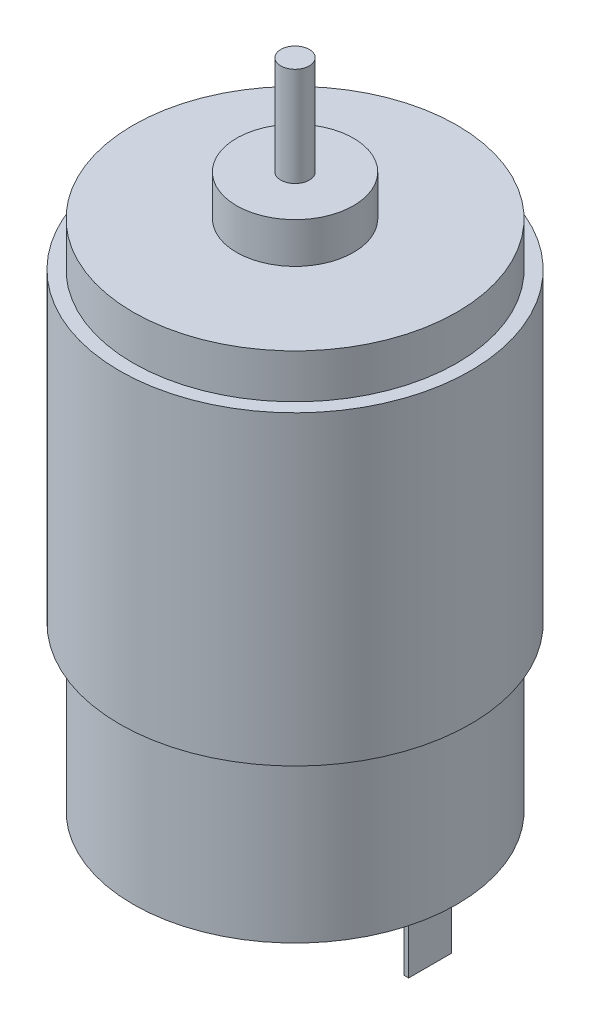
ISO-10303-21;
HEADER;
FILE_DESCRIPTION(('STEP AP214'),'2;1');
FILE_NAME('part.step','',(''),(''),'','','');
FILE_SCHEMA(('AUTOMOTIVE_DESIGN { 1 0 10303 214 1 1 1 1 }'));
ENDSEC;
DATA;
#1=APPLICATION_CONTEXT('core data for automotive mechanical design processes');
#2=APPLICATION_PROTOCOL_DEFINITION('international standard','automotive_design',2000,#1);
#3=PRODUCT_CONTEXT('',#1,'mechanical');
#4=PRODUCT('Part','Part','',(#3));
#5=PRODUCT_RELATED_PRODUCT_CATEGORY('part','',(#4));
#6=PRODUCT_DEFINITION_FORMATION('','',#4);
#7=PRODUCT_DEFINITION_CONTEXT('part definition',#1,'design');
#8=PRODUCT_DEFINITION('design','',#6,#7);
#9=PRODUCT_DEFINITION_SHAPE('','',#8);
#10=(LENGTH_UNIT() NAMED_UNIT(*) SI_UNIT(.MILLI.,.METRE.));
#11=(NAMED_UNIT(*) PLANE_ANGLE_UNIT() SI_UNIT($,.RADIAN.));
#12=(NAMED_UNIT(*) SI_UNIT($,.STERADIAN.) SOLID_ANGLE_UNIT());
#13=UNCERTAINTY_MEASURE_WITH_UNIT(LENGTH_MEASURE(1.E-05),#10,'distance_accuracy_value','');
#14=(GEOMETRIC_REPRESENTATION_CONTEXT(3) GLOBAL_UNCERTAINTY_ASSIGNED_CONTEXT((#13)) GLOBAL_UNIT_ASSIGNED_CONTEXT((#10,
#11,#12)) REPRESENTATION_CONTEXT('',''));
#15=CARTESIAN_POINT('',(0.,0.,0.));
#16=DIRECTION('',(0.,0.,1.));
#17=DIRECTION('',(1.,0.,0.));
#18=AXIS2_PLACEMENT_3D('',#15,#16,#17);
#19=CARTESIAN_POINT('',(0.,-18.1,0.));
#20=DIRECTION('',(0.,1.,0.));
#21=DIRECTION('',(0.,0.,1.));
#22=AXIS2_PLACEMENT_3D('',#19,#20,#21);
#23=PLANE('',#22);
#24=DIRECTION('',(0.,0.,-1.));
#25=VECTOR('',#24,1.);
#26=CARTESIAN_POINT('',(14.5,-18.1,2.375));
#27=LINE('',#26,#25);
#28=CARTESIAN_POINT('',(14.5,-18.1,2.375));
#29=VERTEX_POINT('',#28);
#30=CARTESIAN_POINT('',(14.5,-18.1,-2.375));
#31=VERTEX_POINT('',#30);
#32=EDGE_CURVE('E131',#29,#31,#27,.T.);
#33=ORIENTED_EDGE('',*,*,#32,.F.);
#34=DIRECTION('',(-1.,0.,0.));
#35=VECTOR('',#34,1.);
#36=CARTESIAN_POINT('',(14.5,-18.1,2.375));
#37=LINE('',#36,#35);
#38=CARTESIAN_POINT('',(15.,-18.1,2.375));
#39=VERTEX_POINT('',#38);
#40=EDGE_CURVE('E144',#39,#29,#37,.T.);
#41=ORIENTED_EDGE('',*,*,#40,.F.);
#42=DIRECTION('',(0.,0.,1.));
#43=VECTOR('',#42,1.);
#44=CARTESIAN_POINT('',(15.,-18.1,2.375));
#45=LINE('',#44,#43);
#46=CARTESIAN_POINT('',(15.,-18.1,-2.375));
#47=VERTEX_POINT('',#46);
#48=EDGE_CURVE('E153',#47,#39,#45,.T.);
#49=ORIENTED_EDGE('',*,*,#48,.F.);
#50=DIRECTION('',(1.,0.,0.));
#51=VECTOR('',#50,1.);
#52=CARTESIAN_POINT('',(14.5,-18.1,-2.375));
#53=LINE('',#52,#51);
#54=EDGE_CURVE('E134',#31,#47,#53,.T.);
#55=ORIENTED_EDGE('',*,*,#54,.F.);
#56=EDGE_LOOP('',(#33,#41,#49,#55));
#57=FACE_BOUND('',#56,.T.);
#58=CARTESIAN_POINT('',(0.,-18.1,0.));
#59=DIRECTION('',(0.,1.,0.));
#60=DIRECTION('',(0.,0.,1.));
#61=AXIS2_PLACEMENT_3D('',#58,#59,#60);
#62=CIRCLE('',#61,18.);
#63=CARTESIAN_POINT('',(0.,-18.1,18.));
#64=VERTEX_POINT('',#63);
#65=EDGE_CURVE('E181',#64,#64,#62,.T.);
#66=ORIENTED_EDGE('',*,*,#65,.F.);
#67=EDGE_LOOP('',(#66));
#68=FACE_BOUND('',#67,.T.);
#69=DIRECTION('',(-1.,0.,0.));
#70=VECTOR('',#69,1.);
#71=CARTESIAN_POINT('',(-14.5,-18.1,2.375));
#72=LINE('',#71,#70);
#73=CARTESIAN_POINT('',(-14.5,-18.1,2.375));
#74=VERTEX_POINT('',#73);
#75=CARTESIAN_POINT('',(-15.,-18.1,2.375));
#76=VERTEX_POINT('',#75);
#77=EDGE_CURVE('E130',#74,#76,#72,.T.);
#78=ORIENTED_EDGE('',*,*,#77,.F.);
#79=DIRECTION('',(0.,0.,1.));
#80=VECTOR('',#79,1.);
#81=CARTESIAN_POINT('',(-14.5,-18.1,2.375));
#82=LINE('',#81,#80);
#83=CARTESIAN_POINT('',(-14.5,-18.1,-2.375));
#84=VERTEX_POINT('',#83);
#85=EDGE_CURVE('E127',#84,#74,#82,.T.);
#86=ORIENTED_EDGE('',*,*,#85,.F.);
#87=DIRECTION('',(1.,0.,0.));
#88=VECTOR('',#87,1.);
#89=CARTESIAN_POINT('',(-14.5,-18.1,-2.375));
#90=LINE('',#89,#88);
#91=CARTESIAN_POINT('',(-15.,-18.1,-2.375));
#92=VERTEX_POINT('',#91);
#93=EDGE_CURVE('E65',#92,#84,#90,.T.);
#94=ORIENTED_EDGE('',*,*,#93,.F.);
#95=DIRECTION('',(0.,0.,-1.));
#96=VECTOR('',#95,1.);
#97=CARTESIAN_POINT('',(-15.,-18.1,2.375));
#98=LINE('',#97,#96);
#99=EDGE_CURVE('E60',#76,#92,#98,.T.);
#100=ORIENTED_EDGE('',*,*,#99,.F.);
#101=EDGE_LOOP('',(#78,#86,#94,#100));
#102=FACE_BOUND('',#101,.T.);
#103=ADVANCED_FACE('F43',(#57,#68,#102),#23,.F.);
#104=CARTESIAN_POINT('',(0.,34.,0.));
#105=DIRECTION('',(0.,1.,0.));
#106=DIRECTION('',(0.,0.,1.));
#107=AXIS2_PLACEMENT_3D('',#104,#105,#106);
#108=PLANE('',#107);
#109=CARTESIAN_POINT('',(0.,34.,0.));
#110=DIRECTION('',(0.,1.,0.));
#111=DIRECTION('',(0.,0.,1.));
#112=AXIS2_PLACEMENT_3D('',#109,#110,#111);
#113=CIRCLE('',#112,19.5);
#114=CARTESIAN_POINT('',(0.,34.,19.5));
#115=VERTEX_POINT('',#114);
#116=EDGE_CURVE('E178',#115,#115,#113,.T.);
#117=ORIENTED_EDGE('',*,*,#116,.T.);
#118=EDGE_LOOP('',(#117));
#119=FACE_BOUND('',#118,.T.);
#120=CARTESIAN_POINT('',(0.,34.,0.));
#121=DIRECTION('',(0.,1.,0.));
#122=DIRECTION('',(0.,0.,1.));
#123=AXIS2_PLACEMENT_3D('',#120,#121,#122);
#124=CIRCLE('',#123,18.);
#125=CARTESIAN_POINT('',(0.,34.,18.));
#126=VERTEX_POINT('',#125);
#127=EDGE_CURVE('E187',#126,#126,#124,.T.);
#128=ORIENTED_EDGE('',*,*,#127,.F.);
#129=EDGE_LOOP('',(#128));
#130=FACE_BOUND('',#129,.T.);
#131=ADVANCED_FACE('F199',(#119,#130),#108,.T.);
#132=CARTESIAN_POINT('',(0.,0.,0.));
#133=DIRECTION('',(0.,1.,0.));
#134=DIRECTION('',(0.,0.,1.));
#135=AXIS2_PLACEMENT_3D('',#132,#133,#134);
#136=PLANE('',#135);
#137=CARTESIAN_POINT('',(0.,0.,0.));
#138=DIRECTION('',(0.,1.,0.));
#139=DIRECTION('',(0.,0.,1.));
#140=AXIS2_PLACEMENT_3D('',#137,#138,#139);
#141=CIRCLE('',#140,19.5);
#142=CARTESIAN_POINT('',(0.,0.,19.5));
#143=VERTEX_POINT('',#142);
#144=EDGE_CURVE('E47',#143,#143,#141,.T.);
#145=ORIENTED_EDGE('',*,*,#144,.F.);
#146=EDGE_LOOP('',(#145));
#147=FACE_BOUND('',#146,.T.);
#148=CARTESIAN_POINT('',(0.,0.,0.));
#149=DIRECTION('',(0.,1.,0.));
#150=DIRECTION('',(0.,0.,1.));
#151=AXIS2_PLACEMENT_3D('',#148,#149,#150);
#152=CIRCLE('',#151,18.);
#153=CARTESIAN_POINT('',(0.,0.,18.));
#154=VERTEX_POINT('',#153);
#155=EDGE_CURVE('E184',#154,#154,#152,.T.);
#156=ORIENTED_EDGE('',*,*,#155,.T.);
#157=EDGE_LOOP('',(#156));
#158=FACE_BOUND('',#157,.T.);
#159=ADVANCED_FACE('F196',(#147,#158),#136,.F.);
#160=CARTESIAN_POINT('',(0.,34.,0.));
#161=DIRECTION('',(0.,-1.,0.));
#162=DIRECTION('',(0.,0.,-1.));
#163=AXIS2_PLACEMENT_3D('',#160,#161,#162);
#164=CYLINDRICAL_SURFACE('',#163,19.5);
#165=ORIENTED_EDGE('',*,*,#116,.F.);
#166=EDGE_LOOP('',(#165));
#167=FACE_BOUND('',#166,.T.);
#168=ORIENTED_EDGE('',*,*,#144,.T.);
#169=EDGE_LOOP('',(#168));
#170=FACE_BOUND('',#169,.T.);
#171=ADVANCED_FACE('F45',(#167,#170),#164,.T.);
#172=CARTESIAN_POINT('',(0.,-18.1,0.));
#173=DIRECTION('',(0.,1.,0.));
#174=DIRECTION('',(0.,0.,1.));
#175=AXIS2_PLACEMENT_3D('',#172,#173,#174);
#176=CYLINDRICAL_SURFACE('',#175,18.);
#177=ORIENTED_EDGE('',*,*,#65,.T.);
#178=EDGE_LOOP('',(#177));
#179=FACE_BOUND('',#178,.T.);
#180=ORIENTED_EDGE('',*,*,#155,.F.);
#181=EDGE_LOOP('',(#180));
#182=FACE_BOUND('',#181,.T.);
#183=ADVANCED_FACE('F202',(#179,#182),#176,.T.);
#184=ORIENTED_EDGE('',*,*,#127,.T.);
#185=EDGE_LOOP('',(#184));
#186=FACE_BOUND('',#185,.T.);
#187=CARTESIAN_POINT('',(0.,38.9,0.));
#188=DIRECTION('',(0.,1.,0.));
#189=DIRECTION('',(0.,0.,1.));
#190=AXIS2_PLACEMENT_3D('',#187,#188,#189);
#191=CIRCLE('',#190,18.);
#192=CARTESIAN_POINT('',(0.,38.9,18.));
#193=VERTEX_POINT('',#192);
#194=EDGE_CURVE('E175',#193,#193,#191,.T.);
#195=ORIENTED_EDGE('',*,*,#194,.F.);
#196=EDGE_LOOP('',(#195));
#197=FACE_BOUND('',#196,.T.);
#198=ADVANCED_FACE('F204',(#186,#197),#176,.T.);
#199=CARTESIAN_POINT('',(0.,38.9,0.));
#200=DIRECTION('',(0.,1.,0.));
#201=DIRECTION('',(0.,0.,1.));
#202=AXIS2_PLACEMENT_3D('',#199,#200,#201);
#203=PLANE('',#202);
#204=CARTESIAN_POINT('',(0.,38.9,0.));
#205=DIRECTION('',(0.,1.,0.));
#206=DIRECTION('',(0.,0.,1.));
#207=AXIS2_PLACEMENT_3D('',#204,#205,#206);
#208=CIRCLE('',#207,6.5);
#209=CARTESIAN_POINT('',(0.,38.9,6.5));
#210=VERTEX_POINT('',#209);
#211=EDGE_CURVE('E52',#210,#210,#208,.T.);
#212=ORIENTED_EDGE('',*,*,#211,.F.);
#213=EDGE_LOOP('',(#212));
#214=FACE_BOUND('',#213,.T.);
#215=ORIENTED_EDGE('',*,*,#194,.T.);
#216=EDGE_LOOP('',(#215));
#217=FACE_BOUND('',#216,.T.);
#218=ADVANCED_FACE('F211',(#214,#217),#203,.T.);
#219=CARTESIAN_POINT('',(0.,43.4,0.));
#220=DIRECTION('',(0.,-1.,0.));
#221=DIRECTION('',(0.,0.,-1.));
#222=AXIS2_PLACEMENT_3D('',#219,#220,#221);
#223=CYLINDRICAL_SURFACE('',#222,6.5);
#224=CARTESIAN_POINT('',(0.,43.4,0.));
#225=DIRECTION('',(0.,1.,0.));
#226=DIRECTION('',(0.,0.,1.));
#227=AXIS2_PLACEMENT_3D('',#224,#225,#226);
#228=CIRCLE('',#227,6.5);
#229=CARTESIAN_POINT('',(0.,43.4,6.5));
#230=VERTEX_POINT('',#229);
#231=EDGE_CURVE('E171',#230,#230,#228,.T.);
#232=ORIENTED_EDGE('',*,*,#231,.F.);
#233=EDGE_LOOP('',(#232));
#234=FACE_BOUND('',#233,.T.);
#235=ORIENTED_EDGE('',*,*,#211,.T.);
#236=EDGE_LOOP('',(#235));
#237=FACE_BOUND('',#236,.T.);
#238=ADVANCED_FACE('F227',(#234,#237),#223,.T.);
#239=CARTESIAN_POINT('',(0.,43.4,0.));
#240=DIRECTION('',(0.,1.,0.));
#241=DIRECTION('',(0.,0.,1.));
#242=AXIS2_PLACEMENT_3D('',#239,#240,#241);
#243=PLANE('',#242);
#244=CARTESIAN_POINT('',(0.,43.4,0.));
#245=DIRECTION('',(0.,1.,0.));
#246=DIRECTION('',(0.,0.,1.));
#247=AXIS2_PLACEMENT_3D('',#244,#245,#246);
#248=CIRCLE('',#247,1.585);
#249=CARTESIAN_POINT('',(0.,43.4,1.585));
#250=VERTEX_POINT('',#249);
#251=EDGE_CURVE('E11',#250,#250,#248,.T.);
#252=ORIENTED_EDGE('',*,*,#251,.F.);
#253=EDGE_LOOP('',(#252));
#254=FACE_BOUND('',#253,.T.);
#255=ORIENTED_EDGE('',*,*,#231,.T.);
#256=EDGE_LOOP('',(#255));
#257=FACE_BOUND('',#256,.T.);
#258=ADVANCED_FACE('F231',(#254,#257),#243,.T.);
#259=CARTESIAN_POINT('',(0.,54.4,0.));
#260=DIRECTION('',(0.,-1.,0.));
#261=DIRECTION('',(0.,0.,-1.));
#262=AXIS2_PLACEMENT_3D('',#259,#260,#261);
#263=CYLINDRICAL_SURFACE('',#262,1.585);
#264=CARTESIAN_POINT('',(0.,54.4,0.));
#265=DIRECTION('',(0.,1.,0.));
#266=DIRECTION('',(0.,0.,1.));
#267=AXIS2_PLACEMENT_3D('',#264,#265,#266);
#268=CIRCLE('',#267,1.585);
#269=CARTESIAN_POINT('',(0.,54.4,1.585));
#270=VERTEX_POINT('',#269);
#271=EDGE_CURVE('E169',#270,#270,#268,.T.);
#272=ORIENTED_EDGE('',*,*,#271,.F.);
#273=EDGE_LOOP('',(#272));
#274=FACE_BOUND('',#273,.T.);
#275=ORIENTED_EDGE('',*,*,#251,.T.);
#276=EDGE_LOOP('',(#275));
#277=FACE_BOUND('',#276,.T.);
#278=ADVANCED_FACE('F235',(#274,#277),#263,.T.);
#279=CARTESIAN_POINT('',(0.,54.4,0.));
#280=DIRECTION('',(0.,1.,0.));
#281=DIRECTION('',(0.,0.,1.));
#282=AXIS2_PLACEMENT_3D('',#279,#280,#281);
#283=PLANE('',#282);
#284=ORIENTED_EDGE('',*,*,#271,.T.);
#285=EDGE_LOOP('',(#284));
#286=FACE_BOUND('',#285,.T.);
#287=ADVANCED_FACE('F239',(#286),#283,.T.);
#288=CARTESIAN_POINT('',(14.5,-25.5,2.375));
#289=DIRECTION('',(1.,0.,0.));
#290=DIRECTION('',(0.,0.,-1.));
#291=AXIS2_PLACEMENT_3D('',#288,#289,#290);
#292=PLANE('',#291);
#293=ORIENTED_EDGE('',*,*,#32,.T.);
#294=DIRECTION('',(0.,1.,0.));
#295=VECTOR('',#294,1.);
#296=CARTESIAN_POINT('',(14.5,-25.5,-2.375));
#297=LINE('',#296,#295);
#298=CARTESIAN_POINT('',(14.5,-25.5,-2.375));
#299=VERTEX_POINT('',#298);
#300=EDGE_CURVE('E166',#299,#31,#297,.T.);
#301=ORIENTED_EDGE('',*,*,#300,.F.);
#302=DIRECTION('',(0.,0.,-1.));
#303=VECTOR('',#302,1.);
#304=CARTESIAN_POINT('',(14.5,-25.5,2.375));
#305=LINE('',#304,#303);
#306=CARTESIAN_POINT('',(14.5,-25.5,2.375));
#307=VERTEX_POINT('',#306);
#308=EDGE_CURVE('E140',#307,#299,#305,.T.);
#309=ORIENTED_EDGE('',*,*,#308,.F.);
#310=DIRECTION('',(0.,1.,0.));
#311=VECTOR('',#310,1.);
#312=CARTESIAN_POINT('',(14.5,-25.5,2.375));
#313=LINE('',#312,#311);
#314=EDGE_CURVE('E149',#307,#29,#313,.T.);
#315=ORIENTED_EDGE('',*,*,#314,.T.);
#316=EDGE_LOOP('',(#293,#301,#309,#315));
#317=FACE_BOUND('',#316,.T.);
#318=ADVANCED_FACE('F242',(#317),#292,.F.);
#319=CARTESIAN_POINT('',(14.5,-25.5,-2.375));
#320=DIRECTION('',(0.,0.,1.));
#321=DIRECTION('',(1.,0.,0.));
#322=AXIS2_PLACEMENT_3D('',#319,#320,#321);
#323=PLANE('',#322);
#324=ORIENTED_EDGE('',*,*,#54,.T.);
#325=DIRECTION('',(0.,1.,0.));
#326=VECTOR('',#325,1.);
#327=CARTESIAN_POINT('',(15.,-25.5,-2.375));
#328=LINE('',#327,#326);
#329=CARTESIAN_POINT('',(15.,-25.5,-2.375));
#330=VERTEX_POINT('',#329);
#331=EDGE_CURVE('E163',#330,#47,#328,.T.);
#332=ORIENTED_EDGE('',*,*,#331,.F.);
#333=DIRECTION('',(1.,0.,0.));
#334=VECTOR('',#333,1.);
#335=CARTESIAN_POINT('',(14.5,-25.5,-2.375));
#336=LINE('',#335,#334);
#337=EDGE_CURVE('E143',#299,#330,#336,.T.);
#338=ORIENTED_EDGE('',*,*,#337,.F.);
#339=ORIENTED_EDGE('',*,*,#300,.T.);
#340=EDGE_LOOP('',(#324,#332,#338,#339));
#341=FACE_BOUND('',#340,.T.);
#342=ADVANCED_FACE('F245',(#341),#323,.F.);
#343=CARTESIAN_POINT('',(15.,-25.5,2.375));
#344=DIRECTION('',(-1.,0.,0.));
#345=DIRECTION('',(0.,0.,1.));
#346=AXIS2_PLACEMENT_3D('',#343,#344,#345);
#347=PLANE('',#346);
#348=ORIENTED_EDGE('',*,*,#48,.T.);
#349=DIRECTION('',(0.,1.,0.));
#350=VECTOR('',#349,1.);
#351=CARTESIAN_POINT('',(15.,-25.5,2.375));
#352=LINE('',#351,#350);
#353=CARTESIAN_POINT('',(15.,-25.5,2.375));
#354=VERTEX_POINT('',#353);
#355=EDGE_CURVE('E160',#354,#39,#352,.T.);
#356=ORIENTED_EDGE('',*,*,#355,.F.);
#357=DIRECTION('',(0.,0.,1.));
#358=VECTOR('',#357,1.);
#359=CARTESIAN_POINT('',(15.,-25.5,2.375));
#360=LINE('',#359,#358);
#361=EDGE_CURVE('E146',#330,#354,#360,.T.);
#362=ORIENTED_EDGE('',*,*,#361,.F.);
#363=ORIENTED_EDGE('',*,*,#331,.T.);
#364=EDGE_LOOP('',(#348,#356,#362,#363));
#365=FACE_BOUND('',#364,.T.);
#366=ADVANCED_FACE('F249',(#365),#347,.F.);
#367=CARTESIAN_POINT('',(14.5,-25.5,2.375));
#368=DIRECTION('',(0.,0.,-1.));
#369=DIRECTION('',(-1.,0.,0.));
#370=AXIS2_PLACEMENT_3D('',#367,#368,#369);
#371=PLANE('',#370);
#372=ORIENTED_EDGE('',*,*,#40,.T.);
#373=ORIENTED_EDGE('',*,*,#314,.F.);
#374=DIRECTION('',(-1.,0.,0.));
#375=VECTOR('',#374,1.);
#376=CARTESIAN_POINT('',(14.5,-25.5,2.375));
#377=LINE('',#376,#375);
#378=EDGE_CURVE('E148',#354,#307,#377,.T.);
#379=ORIENTED_EDGE('',*,*,#378,.F.);
#380=ORIENTED_EDGE('',*,*,#355,.T.);
#381=EDGE_LOOP('',(#372,#373,#379,#380));
#382=FACE_BOUND('',#381,.T.);
#383=ADVANCED_FACE('F253',(#382),#371,.F.);
#384=CARTESIAN_POINT('',(0.,-25.5,0.));
#385=DIRECTION('',(0.,-1.,0.));
#386=DIRECTION('',(0.,0.,-1.));
#387=AXIS2_PLACEMENT_3D('',#384,#385,#386);
#388=PLANE('',#387);
#389=ORIENTED_EDGE('',*,*,#308,.T.);
#390=ORIENTED_EDGE('',*,*,#337,.T.);
#391=ORIENTED_EDGE('',*,*,#361,.T.);
#392=ORIENTED_EDGE('',*,*,#378,.T.);
#393=EDGE_LOOP('',(#389,#390,#391,#392));
#394=FACE_BOUND('',#393,.T.);
#395=ADVANCED_FACE('F257',(#394),#388,.T.);
#396=CARTESIAN_POINT('',(-14.5,-25.5,2.375));
#397=DIRECTION('',(0.,0.,-1.));
#398=DIRECTION('',(-1.,0.,0.));
#399=AXIS2_PLACEMENT_3D('',#396,#397,#398);
#400=PLANE('',#399);
#401=ORIENTED_EDGE('',*,*,#77,.T.);
#402=DIRECTION('',(0.,1.,0.));
#403=VECTOR('',#402,1.);
#404=CARTESIAN_POINT('',(-15.,-25.5,2.375));
#405=LINE('',#404,#403);
#406=CARTESIAN_POINT('',(-15.,-25.5,2.375));
#407=VERTEX_POINT('',#406);
#408=EDGE_CURVE('E111',#407,#76,#405,.T.);
#409=ORIENTED_EDGE('',*,*,#408,.F.);
#410=DIRECTION('',(-1.,0.,0.));
#411=VECTOR('',#410,1.);
#412=CARTESIAN_POINT('',(-14.5,-25.5,2.375));
#413=LINE('',#412,#411);
#414=CARTESIAN_POINT('',(-14.5,-25.5,2.375));
#415=VERTEX_POINT('',#414);
#416=EDGE_CURVE('E118',#415,#407,#413,.T.);
#417=ORIENTED_EDGE('',*,*,#416,.F.);
#418=DIRECTION('',(0.,1.,0.));
#419=VECTOR('',#418,1.);
#420=CARTESIAN_POINT('',(-14.5,-25.5,2.375));
#421=LINE('',#420,#419);
#422=EDGE_CURVE('E357',#415,#74,#421,.T.);
#423=ORIENTED_EDGE('',*,*,#422,.T.);
#424=EDGE_LOOP('',(#401,#409,#417,#423));
#425=FACE_BOUND('',#424,.T.);
#426=ADVANCED_FACE('F129',(#425),#400,.F.);
#427=CARTESIAN_POINT('',(-15.,-25.5,2.375));
#428=DIRECTION('',(1.,0.,0.));
#429=DIRECTION('',(0.,0.,-1.));
#430=AXIS2_PLACEMENT_3D('',#427,#428,#429);
#431=PLANE('',#430);
#432=ORIENTED_EDGE('',*,*,#99,.T.);
#433=DIRECTION('',(0.,1.,0.));
#434=VECTOR('',#433,1.);
#435=CARTESIAN_POINT('',(-15.,-25.5,-2.375));
#436=LINE('',#435,#434);
#437=CARTESIAN_POINT('',(-15.,-25.5,-2.375));
#438=VERTEX_POINT('',#437);
#439=EDGE_CURVE('E114',#438,#92,#436,.T.);
#440=ORIENTED_EDGE('',*,*,#439,.F.);
#441=DIRECTION('',(0.,0.,-1.));
#442=VECTOR('',#441,1.);
#443=CARTESIAN_POINT('',(-15.,-25.5,2.375));
#444=LINE('',#443,#442);
#445=EDGE_CURVE('E107',#407,#438,#444,.T.);
#446=ORIENTED_EDGE('',*,*,#445,.F.);
#447=ORIENTED_EDGE('',*,*,#408,.T.);
#448=EDGE_LOOP('',(#432,#440,#446,#447));
#449=FACE_BOUND('',#448,.T.);
#450=ADVANCED_FACE('F109',(#449),#431,.F.);
#451=CARTESIAN_POINT('',(-14.5,-25.5,-2.375));
#452=DIRECTION('',(0.,0.,1.));
#453=DIRECTION('',(1.,0.,0.));
#454=AXIS2_PLACEMENT_3D('',#451,#452,#453);
#455=PLANE('',#454);
#456=ORIENTED_EDGE('',*,*,#93,.T.);
#457=DIRECTION('',(0.,1.,0.));
#458=VECTOR('',#457,1.);
#459=CARTESIAN_POINT('',(-14.5,-25.5,-2.375));
#460=LINE('',#459,#458);
#461=CARTESIAN_POINT('',(-14.5,-25.5,-2.375));
#462=VERTEX_POINT('',#461);
#463=EDGE_CURVE('E136',#462,#84,#460,.T.);
#464=ORIENTED_EDGE('',*,*,#463,.F.);
#465=DIRECTION('',(1.,0.,0.));
#466=VECTOR('',#465,1.);
#467=CARTESIAN_POINT('',(-14.5,-25.5,-2.375));
#468=LINE('',#467,#466);
#469=EDGE_CURVE('E117',#438,#462,#468,.T.);
#470=ORIENTED_EDGE('',*,*,#469,.F.);
#471=ORIENTED_EDGE('',*,*,#439,.T.);
#472=EDGE_LOOP('',(#456,#464,#470,#471));
#473=FACE_BOUND('',#472,.T.);
#474=ADVANCED_FACE('F266',(#473),#455,.F.);
#475=CARTESIAN_POINT('',(-14.5,-25.5,2.375));
#476=DIRECTION('',(-1.,0.,0.));
#477=DIRECTION('',(0.,0.,1.));
#478=AXIS2_PLACEMENT_3D('',#475,#476,#477);
#479=PLANE('',#478);
#480=ORIENTED_EDGE('',*,*,#85,.T.);
#481=ORIENTED_EDGE('',*,*,#422,.F.);
#482=DIRECTION('',(0.,0.,1.));
#483=VECTOR('',#482,1.);
#484=CARTESIAN_POINT('',(-14.5,-25.5,2.375));
#485=LINE('',#484,#483);
#486=EDGE_CURVE('E123',#462,#415,#485,.T.);
#487=ORIENTED_EDGE('',*,*,#486,.F.);
#488=ORIENTED_EDGE('',*,*,#463,.T.);
#489=EDGE_LOOP('',(#480,#481,#487,#488));
#490=FACE_BOUND('',#489,.T.);
#491=ADVANCED_FACE('F269',(#490),#479,.F.);
#492=CARTESIAN_POINT('',(0.,-25.5,0.));
#493=DIRECTION('',(0.,-1.,0.));
#494=DIRECTION('',(0.,0.,-1.));
#495=AXIS2_PLACEMENT_3D('',#492,#493,#494);
#496=PLANE('',#495);
#497=ORIENTED_EDGE('',*,*,#416,.T.);
#498=ORIENTED_EDGE('',*,*,#445,.T.);
#499=ORIENTED_EDGE('',*,*,#469,.T.);
#500=ORIENTED_EDGE('',*,*,#486,.T.);
#501=EDGE_LOOP('',(#497,#498,#499,#500));
#502=FACE_BOUND('',#501,.T.);
#503=ADVANCED_FACE('F121',(#502),#496,.T.);
#504=CLOSED_SHELL('',(#103,#131,#159,#171,#183,#198,#218,#238,#258,#278,#287,#318,#342,#366,
#383,#395,#426,#450,#474,#491,#503));
#505=MANIFOLD_SOLID_BREP('B2',#504);
#506=ADVANCED_BREP_SHAPE_REPRESENTATION('',(#18,#505),#14);
#507=SHAPE_DEFINITION_REPRESENTATION(#9,#506);
ENDSEC;
END-ISO-10303-21;
